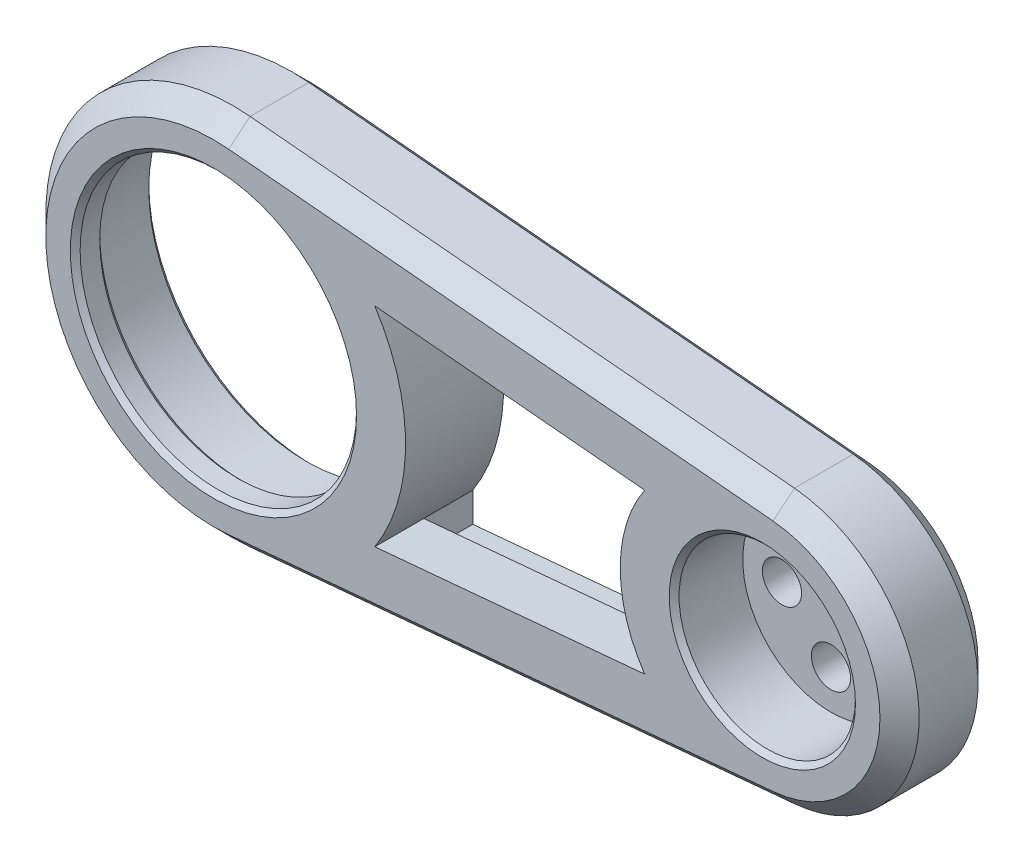
ISO-10303-21;
HEADER;
FILE_DESCRIPTION(('STEP AP214'),'2;1');
FILE_NAME('part.step','',(''),(''),'','','');
FILE_SCHEMA(('AUTOMOTIVE_DESIGN { 1 0 10303 214 1 1 1 1 }'));
ENDSEC;
DATA;
#1=APPLICATION_CONTEXT('core data for automotive mechanical design processes');
#2=APPLICATION_PROTOCOL_DEFINITION('international standard','automotive_design',2000,#1);
#3=PRODUCT_CONTEXT('',#1,'mechanical');
#4=PRODUCT('Part','Part','',(#3));
#5=PRODUCT_RELATED_PRODUCT_CATEGORY('part','',(#4));
#6=PRODUCT_DEFINITION_FORMATION('','',#4);
#7=PRODUCT_DEFINITION_CONTEXT('part definition',#1,'design');
#8=PRODUCT_DEFINITION('design','',#6,#7);
#9=PRODUCT_DEFINITION_SHAPE('','',#8);
#10=(LENGTH_UNIT() NAMED_UNIT(*) SI_UNIT(.MILLI.,.METRE.));
#11=(NAMED_UNIT(*) PLANE_ANGLE_UNIT() SI_UNIT($,.RADIAN.));
#12=(NAMED_UNIT(*) SI_UNIT($,.STERADIAN.) SOLID_ANGLE_UNIT());
#13=UNCERTAINTY_MEASURE_WITH_UNIT(LENGTH_MEASURE(1.E-05),#10,'distance_accuracy_value','');
#14=(GEOMETRIC_REPRESENTATION_CONTEXT(3) GLOBAL_UNCERTAINTY_ASSIGNED_CONTEXT((#13)) GLOBAL_UNIT_ASSIGNED_CONTEXT((#10,
#11,#12)) REPRESENTATION_CONTEXT('',''));
#15=CARTESIAN_POINT('',(0.,0.,0.));
#16=DIRECTION('',(0.,0.,1.));
#17=DIRECTION('',(1.,0.,0.));
#18=AXIS2_PLACEMENT_3D('',#15,#16,#17);
#19=CARTESIAN_POINT('',(1.10196428571428,12.0497167897428,-44.8061825082967));
#20=DIRECTION('',(0.0910714285714284,0.995844362788663,0.));
#21=DIRECTION('',(-0.995844362788664,0.0910714285714284,0.));
#22=AXIS2_PLACEMENT_3D('',#19,#20,#21);
#23=PLANE('',#22);
#24=DIRECTION('',(-0.995844362788664,0.0910714285714284,0.));
#25=VECTOR('',#24,1.);
#26=CARTESIAN_POINT('',(1.10196428571428,12.0497167897428,-5.));
#27=LINE('',#26,#25);
#28=CARTESIAN_POINT('',(43.9918449486673,8.1273742539121,-5.));
#29=VERTEX_POINT('',#28);
#30=CARTESIAN_POINT('',(16.4570318624783,10.6454733233132,-5.));
#31=VERTEX_POINT('',#30);
#32=EDGE_CURVE('E198',#29,#31,#27,.T.);
#33=ORIENTED_EDGE('',*,*,#32,.F.);
#34=DIRECTION('',(0.,0.,1.));
#35=VECTOR('',#34,1.);
#36=CARTESIAN_POINT('',(43.9918449486673,8.1273742539121,-44.8061825082967));
#37=LINE('',#36,#35);
#38=CARTESIAN_POINT('',(43.9918449486673,8.1273742539121,0.));
#39=VERTEX_POINT('',#38);
#40=EDGE_CURVE('E254',#29,#39,#37,.T.);
#41=ORIENTED_EDGE('',*,*,#40,.T.);
#42=DIRECTION('',(-0.995844362788664,0.0910714285714284,0.));
#43=VECTOR('',#42,1.);
#44=CARTESIAN_POINT('',(1.10196428571428,12.0497167897428,0.));
#45=LINE('',#44,#43);
#46=CARTESIAN_POINT('',(16.4570318624783,10.6454733233132,0.));
#47=VERTEX_POINT('',#46);
#48=EDGE_CURVE('E231',#39,#47,#45,.T.);
#49=ORIENTED_EDGE('',*,*,#48,.T.);
#50=DIRECTION('',(0.,0.,1.));
#51=VECTOR('',#50,1.);
#52=CARTESIAN_POINT('',(16.4570318624783,10.6454733233132,-44.8061825082967));
#53=LINE('',#52,#51);
#54=EDGE_CURVE('E235',#31,#47,#53,.T.);
#55=ORIENTED_EDGE('',*,*,#54,.F.);
#56=EDGE_LOOP('',(#33,#41,#49,#55));
#57=FACE_BOUND('',#56,.T.);
#58=ADVANCED_FACE('F50',(#57),#23,.F.);
#59=CARTESIAN_POINT('',(1.10196428571428,-12.0497167897428,-44.8061825082967));
#60=DIRECTION('',(0.0910714285714282,-0.995844362788663,0.));
#61=DIRECTION('',(0.995844362788664,0.0910714285714282,0.));
#62=AXIS2_PLACEMENT_3D('',#59,#60,#61);
#63=PLANE('',#62);
#64=DIRECTION('',(0.995844362788664,0.0910714285714282,0.));
#65=VECTOR('',#64,1.);
#66=CARTESIAN_POINT('',(1.10196428571428,-12.0497167897428,-5.));
#67=LINE('',#66,#65);
#68=CARTESIAN_POINT('',(16.4570318624783,-10.6454733233132,-5.));
#69=VERTEX_POINT('',#68);
#70=CARTESIAN_POINT('',(43.9918449486673,-8.12737425391211,-5.));
#71=VERTEX_POINT('',#70);
#72=EDGE_CURVE('E213',#69,#71,#67,.T.);
#73=ORIENTED_EDGE('',*,*,#72,.F.);
#74=DIRECTION('',(0.,0.,1.));
#75=VECTOR('',#74,1.);
#76=CARTESIAN_POINT('',(16.4570318624783,-10.6454733233132,-44.8061825082967));
#77=LINE('',#76,#75);
#78=CARTESIAN_POINT('',(16.4570318624783,-10.6454733233132,0.));
#79=VERTEX_POINT('',#78);
#80=EDGE_CURVE('E253',#69,#79,#77,.T.);
#81=ORIENTED_EDGE('',*,*,#80,.T.);
#82=DIRECTION('',(0.995844362788664,0.0910714285714282,0.));
#83=VECTOR('',#82,1.);
#84=CARTESIAN_POINT('',(1.10196428571428,-12.0497167897428,0.));
#85=LINE('',#84,#83);
#86=CARTESIAN_POINT('',(43.9918449486673,-8.1273742539121,0.));
#87=VERTEX_POINT('',#86);
#88=EDGE_CURVE('E230',#79,#87,#85,.T.);
#89=ORIENTED_EDGE('',*,*,#88,.T.);
#90=DIRECTION('',(0.,0.,1.));
#91=VECTOR('',#90,1.);
#92=CARTESIAN_POINT('',(43.9918449486673,-8.12737425391211,-44.8061825082967));
#93=LINE('',#92,#91);
#94=EDGE_CURVE('E240',#71,#87,#93,.T.);
#95=ORIENTED_EDGE('',*,*,#94,.F.);
#96=EDGE_LOOP('',(#73,#81,#89,#95));
#97=FACE_BOUND('',#96,.T.);
#98=ADVANCED_FACE('F433',(#97),#63,.F.);
#99=CARTESIAN_POINT('',(0.,0.,-7.));
#100=DIRECTION('',(0.,0.,1.));
#101=DIRECTION('',(1.,0.,0.));
#102=AXIS2_PLACEMENT_3D('',#99,#100,#101);
#103=CYLINDRICAL_SURFACE('',#102,16.1);
#104=CARTESIAN_POINT('',(0.,0.,-9.5));
#105=DIRECTION('',(0.,0.,-1.));
#106=DIRECTION('',(-1.,0.,0.));
#107=AXIS2_PLACEMENT_3D('',#104,#105,#106);
#108=CIRCLE('',#107,16.1);
#109=CARTESIAN_POINT('',(-16.1,0.,-9.5));
#110=VERTEX_POINT('',#109);
#111=EDGE_CURVE('E314',#110,#110,#108,.T.);
#112=ORIENTED_EDGE('',*,*,#111,.T.);
#113=EDGE_LOOP('',(#112));
#114=FACE_BOUND('',#113,.T.);
#115=CARTESIAN_POINT('',(0.,0.,-3.));
#116=DIRECTION('',(0.,0.,1.));
#117=DIRECTION('',(1.,0.,0.));
#118=AXIS2_PLACEMENT_3D('',#115,#116,#117);
#119=CIRCLE('',#118,16.1);
#120=CARTESIAN_POINT('',(16.1,0.,-3.));
#121=VERTEX_POINT('',#120);
#122=EDGE_CURVE('E292',#121,#121,#119,.F.);
#123=ORIENTED_EDGE('',*,*,#122,.F.);
#124=EDGE_LOOP('',(#123));
#125=FACE_BOUND('',#124,.T.);
#126=ADVANCED_FACE('F429',(#114,#125),#103,.F.);
#127=CARTESIAN_POINT('',(1.73946428571429,-19.0206273292635,-7.));
#128=DIRECTION('',(0.0910714285714286,-0.995844362788664,0.));
#129=DIRECTION('',(0.995844362788664,0.0910714285714286,0.));
#130=AXIS2_PLACEMENT_3D('',#127,#128,#129);
#131=PLANE('',#130);
#132=DIRECTION('',(0.,0.,1.));
#133=VECTOR('',#132,1.);
#134=CARTESIAN_POINT('',(1.73946428571429,-19.0206273292635,-7.));
#135=LINE('',#134,#133);
#136=CARTESIAN_POINT('',(1.73946428571429,-19.0206273292635,-7.99999999999998));
#137=VERTEX_POINT('',#136);
#138=CARTESIAN_POINT('',(1.73946428571429,-19.0206273292635,-2.));
#139=VERTEX_POINT('',#138);
#140=EDGE_CURVE('E289',#137,#139,#135,.T.);
#141=ORIENTED_EDGE('',*,*,#140,.F.);
#142=DIRECTION('',(0.995844362788664,0.0910714285714286,0.));
#143=VECTOR('',#142,1.);
#144=CARTESIAN_POINT('',(1.73946428571429,-19.0206273292635,-7.99999999999998));
#145=LINE('',#144,#143);
#146=CARTESIAN_POINT('',(57.275,-13.9418210790413,-7.99999999999998));
#147=VERTEX_POINT('',#146);
#148=EDGE_CURVE('E339',#137,#147,#145,.T.);
#149=ORIENTED_EDGE('',*,*,#148,.T.);
#150=DIRECTION('',(0.,0.,1.));
#151=VECTOR('',#150,1.);
#152=CARTESIAN_POINT('',(57.275,-13.9418210790413,-7.));
#153=LINE('',#152,#151);
#154=CARTESIAN_POINT('',(57.275,-13.9418210790413,-2.));
#155=VERTEX_POINT('',#154);
#156=EDGE_CURVE('E290',#147,#155,#153,.T.);
#157=ORIENTED_EDGE('',*,*,#156,.T.);
#158=DIRECTION('',(-0.995844362788664,-0.0910714285714286,0.));
#159=VECTOR('',#158,1.);
#160=CARTESIAN_POINT('',(1.73946428571429,-19.0206273292635,-2.));
#161=LINE('',#160,#159);
#162=EDGE_CURVE('E337',#155,#139,#161,.T.);
#163=ORIENTED_EDGE('',*,*,#162,.T.);
#164=EDGE_LOOP('',(#141,#149,#157,#163));
#165=FACE_BOUND('',#164,.T.);
#166=ADVANCED_FACE('F404',(#165),#131,.T.);
#167=CARTESIAN_POINT('',(0.,0.,-7.));
#168=DIRECTION('',(0.,0.,1.));
#169=DIRECTION('',(1.,0.,0.));
#170=AXIS2_PLACEMENT_3D('',#167,#168,#169);
#171=CYLINDRICAL_SURFACE('',#170,19.1);
#172=DIRECTION('',(0.,0.,1.));
#173=VECTOR('',#172,1.);
#174=CARTESIAN_POINT('',(1.73946428571429,19.0206273292635,-7.));
#175=LINE('',#174,#173);
#176=CARTESIAN_POINT('',(1.73946428571429,19.0206273292635,-7.99999999999998));
#177=VERTEX_POINT('',#176);
#178=CARTESIAN_POINT('',(1.73946428571429,19.0206273292635,-2.));
#179=VERTEX_POINT('',#178);
#180=EDGE_CURVE('E291',#177,#179,#175,.T.);
#181=ORIENTED_EDGE('',*,*,#180,.F.);
#182=CARTESIAN_POINT('',(0.,0.,-7.99999999999998));
#183=DIRECTION('',(0.,0.,-1.));
#184=DIRECTION('',(-1.,0.,0.));
#185=AXIS2_PLACEMENT_3D('',#182,#183,#184);
#186=CIRCLE('',#185,19.1);
#187=EDGE_CURVE('E341',#177,#137,#186,.F.);
#188=ORIENTED_EDGE('',*,*,#187,.T.);
#189=ORIENTED_EDGE('',*,*,#140,.T.);
#190=CARTESIAN_POINT('',(0.,0.,-2.));
#191=DIRECTION('',(0.,0.,1.));
#192=DIRECTION('',(1.,0.,0.));
#193=AXIS2_PLACEMENT_3D('',#190,#191,#192);
#194=CIRCLE('',#193,19.1);
#195=EDGE_CURVE('E345',#139,#179,#194,.F.);
#196=ORIENTED_EDGE('',*,*,#195,.T.);
#197=EDGE_LOOP('',(#181,#188,#189,#196));
#198=FACE_BOUND('',#197,.T.);
#199=ADVANCED_FACE('F423',(#198),#171,.T.);
#200=CARTESIAN_POINT('',(1.73946428571429,19.0206273292635,-7.));
#201=DIRECTION('',(-0.0910714285714286,-0.995844362788664,0.));
#202=DIRECTION('',(0.995844362788664,-0.0910714285714286,0.));
#203=AXIS2_PLACEMENT_3D('',#200,#201,#202);
#204=PLANE('',#203);
#205=DIRECTION('',(0.,0.,1.));
#206=VECTOR('',#205,1.);
#207=CARTESIAN_POINT('',(57.275,13.9418210790413,-7.));
#208=LINE('',#207,#206);
#209=CARTESIAN_POINT('',(57.275,13.9418210790413,-7.99999999999998));
#210=VERTEX_POINT('',#209);
#211=CARTESIAN_POINT('',(57.275,13.9418210790413,-2.));
#212=VERTEX_POINT('',#211);
#213=EDGE_CURVE('E298',#210,#212,#208,.T.);
#214=ORIENTED_EDGE('',*,*,#213,.F.);
#215=DIRECTION('',(-0.995844362788664,0.0910714285714286,0.));
#216=VECTOR('',#215,1.);
#217=CARTESIAN_POINT('',(1.73946428571429,19.0206273292635,-7.99999999999998));
#218=LINE('',#217,#216);
#219=EDGE_CURVE('E355',#210,#177,#218,.T.);
#220=ORIENTED_EDGE('',*,*,#219,.T.);
#221=ORIENTED_EDGE('',*,*,#180,.T.);
#222=DIRECTION('',(0.995844362788664,-0.0910714285714286,0.));
#223=VECTOR('',#222,1.);
#224=CARTESIAN_POINT('',(57.275,13.9418210790413,-2.));
#225=LINE('',#224,#223);
#226=EDGE_CURVE('E346',#179,#212,#225,.T.);
#227=ORIENTED_EDGE('',*,*,#226,.T.);
#228=EDGE_LOOP('',(#214,#220,#221,#227));
#229=FACE_BOUND('',#228,.T.);
#230=ADVANCED_FACE('F389',(#229),#204,.F.);
#231=CARTESIAN_POINT('',(56.,0.,-7.));
#232=DIRECTION('',(0.,0.,1.));
#233=DIRECTION('',(1.,0.,0.));
#234=AXIS2_PLACEMENT_3D('',#231,#232,#233);
#235=CYLINDRICAL_SURFACE('',#234,14.);
#236=ORIENTED_EDGE('',*,*,#156,.F.);
#237=CARTESIAN_POINT('',(56.,0.,-7.99999999999998));
#238=DIRECTION('',(0.,0.,-1.));
#239=DIRECTION('',(-1.,0.,0.));
#240=AXIS2_PLACEMENT_3D('',#237,#238,#239);
#241=CIRCLE('',#240,14.);
#242=EDGE_CURVE('E347',#147,#210,#241,.F.);
#243=ORIENTED_EDGE('',*,*,#242,.T.);
#244=ORIENTED_EDGE('',*,*,#213,.T.);
#245=CARTESIAN_POINT('',(56.,0.,-2.));
#246=DIRECTION('',(0.,0.,1.));
#247=DIRECTION('',(1.,0.,0.));
#248=AXIS2_PLACEMENT_3D('',#245,#246,#247);
#249=CIRCLE('',#248,14.);
#250=EDGE_CURVE('E348',#212,#155,#249,.F.);
#251=ORIENTED_EDGE('',*,*,#250,.T.);
#252=EDGE_LOOP('',(#236,#243,#244,#251));
#253=FACE_BOUND('',#252,.T.);
#254=ADVANCED_FACE('F392',(#253),#235,.T.);
#255=CARTESIAN_POINT('',(56.,0.,-7.));
#256=DIRECTION('',(0.,0.,1.));
#257=DIRECTION('',(1.,0.,0.));
#258=AXIS2_PLACEMENT_3D('',#255,#256,#257);
#259=CYLINDRICAL_SURFACE('',#258,9.);
#260=CARTESIAN_POINT('',(56.,0.,-0.499999999999981));
#261=DIRECTION('',(0.,0.,1.));
#262=DIRECTION('',(1.,0.,0.));
#263=AXIS2_PLACEMENT_3D('',#260,#261,#262);
#264=CIRCLE('',#263,9.);
#265=CARTESIAN_POINT('',(65.,0.,-0.499999999999981));
#266=VERTEX_POINT('',#265);
#267=EDGE_CURVE('E303',#266,#266,#264,.T.);
#268=ORIENTED_EDGE('',*,*,#267,.T.);
#269=EDGE_LOOP('',(#268));
#270=FACE_BOUND('',#269,.T.);
#271=CARTESIAN_POINT('',(56.,0.,-7.));
#272=DIRECTION('',(0.,0.,1.));
#273=DIRECTION('',(1.,0.,0.));
#274=AXIS2_PLACEMENT_3D('',#271,#272,#273);
#275=CIRCLE('',#274,9.);
#276=CARTESIAN_POINT('',(65.,0.,-7.));
#277=VERTEX_POINT('',#276);
#278=EDGE_CURVE('E285',#277,#277,#275,.T.);
#279=ORIENTED_EDGE('',*,*,#278,.F.);
#280=EDGE_LOOP('',(#279));
#281=FACE_BOUND('',#280,.T.);
#282=ADVANCED_FACE('F476',(#270,#281),#259,.F.);
#283=CARTESIAN_POINT('',(0.,0.,0.));
#284=DIRECTION('',(0.,0.,1.));
#285=DIRECTION('',(1.,0.,0.));
#286=AXIS2_PLACEMENT_3D('',#283,#284,#285);
#287=PLANE('',#286);
#288=ORIENTED_EDGE('',*,*,#48,.F.);
#289=CARTESIAN_POINT('',(56.,0.,0.));
#290=DIRECTION('',(0.,0.,1.));
#291=DIRECTION('',(1.,0.,0.));
#292=AXIS2_PLACEMENT_3D('',#289,#290,#291);
#293=CIRCLE('',#292,14.5);
#294=EDGE_CURVE('E245',#39,#87,#293,.T.);
#295=ORIENTED_EDGE('',*,*,#294,.T.);
#296=ORIENTED_EDGE('',*,*,#88,.F.);
#297=CARTESIAN_POINT('',(0.,0.,0.));
#298=DIRECTION('',(0.,0.,1.));
#299=DIRECTION('',(1.,0.,0.));
#300=AXIS2_PLACEMENT_3D('',#297,#298,#299);
#301=CIRCLE('',#300,19.6);
#302=EDGE_CURVE('E234',#79,#47,#301,.T.);
#303=ORIENTED_EDGE('',*,*,#302,.T.);
#304=EDGE_LOOP('',(#288,#295,#296,#303));
#305=FACE_BOUND('',#304,.T.);
#306=CARTESIAN_POINT('',(0.,0.,0.));
#307=DIRECTION('',(0.,0.,1.));
#308=DIRECTION('',(1.,0.,0.));
#309=AXIS2_PLACEMENT_3D('',#306,#307,#308);
#310=CIRCLE('',#309,17.1);
#311=CARTESIAN_POINT('',(1.55732142857143,17.0289386036861,0.));
#312=VERTEX_POINT('',#311);
#313=CARTESIAN_POINT('',(1.55732142857143,-17.0289386036861,0.));
#314=VERTEX_POINT('',#313);
#315=EDGE_CURVE('E60',#312,#314,#310,.T.);
#316=ORIENTED_EDGE('',*,*,#315,.T.);
#317=DIRECTION('',(0.995844362788664,0.0910714285714286,0.));
#318=VECTOR('',#317,1.);
#319=CARTESIAN_POINT('',(1.55732142857143,-17.0289386036861,0.));
#320=LINE('',#319,#318);
#321=CARTESIAN_POINT('',(57.0928571428571,-11.950132353464,0.));
#322=VERTEX_POINT('',#321);
#323=EDGE_CURVE('E11',#314,#322,#320,.T.);
#324=ORIENTED_EDGE('',*,*,#323,.T.);
#325=CARTESIAN_POINT('',(56.,0.,0.));
#326=DIRECTION('',(0.,0.,1.));
#327=DIRECTION('',(1.,0.,0.));
#328=AXIS2_PLACEMENT_3D('',#325,#326,#327);
#329=CIRCLE('',#328,12.);
#330=CARTESIAN_POINT('',(57.0928571428571,11.9501323534639,0.));
#331=VERTEX_POINT('',#330);
#332=EDGE_CURVE('E358',#322,#331,#329,.T.);
#333=ORIENTED_EDGE('',*,*,#332,.T.);
#334=DIRECTION('',(-0.995844362788664,0.0910714285714286,0.));
#335=VECTOR('',#334,1.);
#336=CARTESIAN_POINT('',(1.55732142857143,17.0289386036861,0.));
#337=LINE('',#336,#335);
#338=EDGE_CURVE('E354',#331,#312,#337,.T.);
#339=ORIENTED_EDGE('',*,*,#338,.T.);
#340=EDGE_LOOP('',(#316,#324,#333,#339));
#341=FACE_BOUND('',#340,.T.);
#342=CARTESIAN_POINT('',(56.,0.,0.));
#343=DIRECTION('',(0.,0.,1.));
#344=DIRECTION('',(1.,0.,0.));
#345=AXIS2_PLACEMENT_3D('',#342,#343,#344);
#346=CIRCLE('',#345,9.5);
#347=CARTESIAN_POINT('',(65.5,0.,0.));
#348=VERTEX_POINT('',#347);
#349=EDGE_CURVE('E307',#348,#348,#346,.F.);
#350=ORIENTED_EDGE('',*,*,#349,.T.);
#351=EDGE_LOOP('',(#350));
#352=FACE_BOUND('',#351,.T.);
#353=CARTESIAN_POINT('',(0.,0.,0.));
#354=DIRECTION('',(0.,0.,1.));
#355=DIRECTION('',(1.,0.,0.));
#356=AXIS2_PLACEMENT_3D('',#353,#354,#355);
#357=CIRCLE('',#356,14.6);
#358=CARTESIAN_POINT('',(14.6,0.,0.));
#359=VERTEX_POINT('',#358);
#360=EDGE_CURVE('E306',#359,#359,#357,.F.);
#361=ORIENTED_EDGE('',*,*,#360,.T.);
#362=EDGE_LOOP('',(#361));
#363=FACE_BOUND('',#362,.T.);
#364=ADVANCED_FACE('F479',(#305,#341,#352,#363),#287,.T.);
#365=CARTESIAN_POINT('',(0.,0.,-7.));
#366=DIRECTION('',(0.,0.,-1.));
#367=DIRECTION('',(-1.,0.,0.));
#368=AXIS2_PLACEMENT_3D('',#365,#366,#367);
#369=PLANE('',#368);
#370=CARTESIAN_POINT('',(56.,5.,-7.));
#371=DIRECTION('',(0.,0.,-1.));
#372=DIRECTION('',(-1.,0.,0.));
#373=AXIS2_PLACEMENT_3D('',#370,#371,#372);
#374=CIRCLE('',#373,2.);
#375=CARTESIAN_POINT('',(54.,5.,-7.));
#376=VERTEX_POINT('',#375);
#377=EDGE_CURVE('E262',#376,#376,#374,.F.);
#378=ORIENTED_EDGE('',*,*,#377,.F.);
#379=EDGE_LOOP('',(#378));
#380=FACE_BOUND('',#379,.T.);
#381=CARTESIAN_POINT('',(60.9999999999999,0.,-7.));
#382=DIRECTION('',(0.,0.,-1.));
#383=DIRECTION('',(-1.,0.,0.));
#384=AXIS2_PLACEMENT_3D('',#381,#382,#383);
#385=CIRCLE('',#384,2.);
#386=CARTESIAN_POINT('',(58.9999999999999,0.,-7.));
#387=VERTEX_POINT('',#386);
#388=EDGE_CURVE('E265',#387,#387,#385,.F.);
#389=ORIENTED_EDGE('',*,*,#388,.F.);
#390=EDGE_LOOP('',(#389));
#391=FACE_BOUND('',#390,.T.);
#392=CARTESIAN_POINT('',(55.9999999999999,-5.,-7.));
#393=DIRECTION('',(0.,0.,-1.));
#394=DIRECTION('',(-1.,0.,0.));
#395=AXIS2_PLACEMENT_3D('',#392,#393,#394);
#396=CIRCLE('',#395,2.00000000000001);
#397=CARTESIAN_POINT('',(53.9999999999999,-5.,-7.));
#398=VERTEX_POINT('',#397);
#399=EDGE_CURVE('E272',#398,#398,#396,.F.);
#400=ORIENTED_EDGE('',*,*,#399,.F.);
#401=EDGE_LOOP('',(#400));
#402=FACE_BOUND('',#401,.T.);
#403=CARTESIAN_POINT('',(50.9999999999999,0.,-7.));
#404=DIRECTION('',(0.,0.,-1.));
#405=DIRECTION('',(-1.,0.,0.));
#406=AXIS2_PLACEMENT_3D('',#403,#404,#405);
#407=CIRCLE('',#406,2.);
#408=CARTESIAN_POINT('',(48.9999999999999,0.,-7.));
#409=VERTEX_POINT('',#408);
#410=EDGE_CURVE('E280',#409,#409,#407,.F.);
#411=ORIENTED_EDGE('',*,*,#410,.F.);
#412=EDGE_LOOP('',(#411));
#413=FACE_BOUND('',#412,.T.);
#414=ORIENTED_EDGE('',*,*,#278,.T.);
#415=EDGE_LOOP('',(#414));
#416=FACE_BOUND('',#415,.T.);
#417=ADVANCED_FACE('F474',(#380,#391,#402,#413,#416),#369,.F.);
#418=CARTESIAN_POINT('',(0.,0.,-10.));
#419=DIRECTION('',(0.,0.,-1.));
#420=DIRECTION('',(-1.,0.,0.));
#421=AXIS2_PLACEMENT_3D('',#418,#419,#420);
#422=PLANE('',#421);
#423=DIRECTION('',(0.,-1.,0.));
#424=VECTOR('',#423,1.);
#425=CARTESIAN_POINT('',(43.9918449486673,0.,-10.));
#426=LINE('',#425,#424);
#427=CARTESIAN_POINT('',(43.9918449486673,11.1398931897015,-10.));
#428=VERTEX_POINT('',#427);
#429=CARTESIAN_POINT('',(43.9918449486673,8.1273742539121,-10.));
#430=VERTEX_POINT('',#429);
#431=EDGE_CURVE('E205',#428,#430,#426,.T.);
#432=ORIENTED_EDGE('',*,*,#431,.F.);
#433=DIRECTION('',(-0.995844362788664,0.0910714285714284,0.));
#434=VECTOR('',#433,1.);
#435=CARTESIAN_POINT('',(1.37517857142857,15.0372498781088,-10.));
#436=LINE('',#435,#434);
#437=CARTESIAN_POINT('',(16.4570318624783,13.6579922591026,-10.));
#438=VERTEX_POINT('',#437);
#439=EDGE_CURVE('E177',#428,#438,#436,.T.);
#440=ORIENTED_EDGE('',*,*,#439,.T.);
#441=DIRECTION('',(0.,-1.,0.));
#442=VECTOR('',#441,1.);
#443=CARTESIAN_POINT('',(16.4570318624783,0.,-10.));
#444=LINE('',#443,#442);
#445=CARTESIAN_POINT('',(16.4570318624783,10.6454733233132,-10.));
#446=VERTEX_POINT('',#445);
#447=EDGE_CURVE('E192',#438,#446,#444,.T.);
#448=ORIENTED_EDGE('',*,*,#447,.T.);
#449=CARTESIAN_POINT('',(0.,0.,-10.));
#450=DIRECTION('',(0.,0.,-1.));
#451=DIRECTION('',(-1.,0.,0.));
#452=AXIS2_PLACEMENT_3D('',#449,#450,#451);
#453=CIRCLE('',#452,19.6);
#454=CARTESIAN_POINT('',(16.4570318624783,-10.6454733233132,-10.));
#455=VERTEX_POINT('',#454);
#456=EDGE_CURVE('E241',#455,#446,#453,.F.);
#457=ORIENTED_EDGE('',*,*,#456,.F.);
#458=DIRECTION('',(0.,1.,0.));
#459=VECTOR('',#458,1.);
#460=CARTESIAN_POINT('',(16.4570318624783,0.,-10.));
#461=LINE('',#460,#459);
#462=CARTESIAN_POINT('',(16.4570318624783,-13.6579922591026,-10.));
#463=VERTEX_POINT('',#462);
#464=EDGE_CURVE('E224',#463,#455,#461,.T.);
#465=ORIENTED_EDGE('',*,*,#464,.F.);
#466=DIRECTION('',(-0.995844362788664,-0.0910714285714282,0.));
#467=VECTOR('',#466,1.);
#468=CARTESIAN_POINT('',(1.37517857142856,-15.0372498781088,-10.));
#469=LINE('',#468,#467);
#470=CARTESIAN_POINT('',(43.9918449486673,-11.1398931897015,-10.));
#471=VERTEX_POINT('',#470);
#472=EDGE_CURVE('E222',#471,#463,#469,.T.);
#473=ORIENTED_EDGE('',*,*,#472,.F.);
#474=DIRECTION('',(0.,1.,0.));
#475=VECTOR('',#474,1.);
#476=CARTESIAN_POINT('',(43.9918449486673,0.,-10.));
#477=LINE('',#476,#475);
#478=CARTESIAN_POINT('',(43.9918449486673,-8.12737425391211,-10.));
#479=VERTEX_POINT('',#478);
#480=EDGE_CURVE('E73',#471,#479,#477,.T.);
#481=ORIENTED_EDGE('',*,*,#480,.T.);
#482=CARTESIAN_POINT('',(56.,0.,-10.));
#483=DIRECTION('',(0.,0.,-1.));
#484=DIRECTION('',(-1.,0.,0.));
#485=AXIS2_PLACEMENT_3D('',#482,#483,#484);
#486=CIRCLE('',#485,14.5);
#487=EDGE_CURVE('E210',#430,#479,#486,.F.);
#488=ORIENTED_EDGE('',*,*,#487,.F.);
#489=EDGE_LOOP('',(#432,#440,#448,#457,#465,#473,#481,#488));
#490=FACE_BOUND('',#489,.T.);
#491=CARTESIAN_POINT('',(56.,5.,-10.));
#492=DIRECTION('',(0.,0.,-1.));
#493=DIRECTION('',(-1.,0.,0.));
#494=AXIS2_PLACEMENT_3D('',#491,#492,#493);
#495=CIRCLE('',#494,2.);
#496=CARTESIAN_POINT('',(54.,5.,-10.));
#497=VERTEX_POINT('',#496);
#498=EDGE_CURVE('E258',#497,#497,#495,.T.);
#499=ORIENTED_EDGE('',*,*,#498,.F.);
#500=EDGE_LOOP('',(#499));
#501=FACE_BOUND('',#500,.T.);
#502=CARTESIAN_POINT('',(60.9999999999999,0.,-10.));
#503=DIRECTION('',(0.,0.,-1.));
#504=DIRECTION('',(-1.,0.,0.));
#505=AXIS2_PLACEMENT_3D('',#502,#503,#504);
#506=CIRCLE('',#505,2.);
#507=CARTESIAN_POINT('',(58.9999999999999,0.,-10.));
#508=VERTEX_POINT('',#507);
#509=EDGE_CURVE('E268',#508,#508,#506,.T.);
#510=ORIENTED_EDGE('',*,*,#509,.F.);
#511=EDGE_LOOP('',(#510));
#512=FACE_BOUND('',#511,.T.);
#513=CARTESIAN_POINT('',(55.9999999999999,-5.,-10.));
#514=DIRECTION('',(0.,0.,-1.));
#515=DIRECTION('',(-1.,0.,0.));
#516=AXIS2_PLACEMENT_3D('',#513,#514,#515);
#517=CIRCLE('',#516,2.00000000000001);
#518=CARTESIAN_POINT('',(53.9999999999999,-5.,-10.));
#519=VERTEX_POINT('',#518);
#520=EDGE_CURVE('E274',#519,#519,#517,.T.);
#521=ORIENTED_EDGE('',*,*,#520,.F.);
#522=EDGE_LOOP('',(#521));
#523=FACE_BOUND('',#522,.T.);
#524=CARTESIAN_POINT('',(50.9999999999999,0.,-10.));
#525=DIRECTION('',(0.,0.,-1.));
#526=DIRECTION('',(-1.,0.,0.));
#527=AXIS2_PLACEMENT_3D('',#524,#525,#526);
#528=CIRCLE('',#527,2.);
#529=CARTESIAN_POINT('',(48.9999999999999,0.,-10.));
#530=VERTEX_POINT('',#529);
#531=EDGE_CURVE('E244',#530,#530,#528,.T.);
#532=ORIENTED_EDGE('',*,*,#531,.F.);
#533=EDGE_LOOP('',(#532));
#534=FACE_BOUND('',#533,.T.);
#535=CARTESIAN_POINT('',(56.,0.,-10.));
#536=DIRECTION('',(0.,0.,-1.));
#537=DIRECTION('',(-1.,0.,0.));
#538=AXIS2_PLACEMENT_3D('',#535,#536,#537);
#539=CIRCLE('',#538,12.);
#540=CARTESIAN_POINT('',(57.0928571428571,11.950132353464,-10.));
#541=VERTEX_POINT('',#540);
#542=CARTESIAN_POINT('',(57.0928571428571,-11.950132353464,-10.));
#543=VERTEX_POINT('',#542);
#544=EDGE_CURVE('E330',#541,#543,#539,.T.);
#545=ORIENTED_EDGE('',*,*,#544,.T.);
#546=DIRECTION('',(-0.995844362788664,-0.0910714285714286,0.));
#547=VECTOR('',#546,1.);
#548=CARTESIAN_POINT('',(1.55732142857143,-17.0289386036861,-10.));
#549=LINE('',#548,#547);
#550=CARTESIAN_POINT('',(1.55732142857143,-17.0289386036861,-10.));
#551=VERTEX_POINT('',#550);
#552=EDGE_CURVE('E333',#543,#551,#549,.T.);
#553=ORIENTED_EDGE('',*,*,#552,.T.);
#554=CARTESIAN_POINT('',(0.,0.,-10.));
#555=DIRECTION('',(0.,0.,-1.));
#556=DIRECTION('',(-1.,0.,0.));
#557=AXIS2_PLACEMENT_3D('',#554,#555,#556);
#558=CIRCLE('',#557,17.1);
#559=CARTESIAN_POINT('',(1.55732142857143,17.0289386036861,-10.));
#560=VERTEX_POINT('',#559);
#561=EDGE_CURVE('E332',#551,#560,#558,.T.);
#562=ORIENTED_EDGE('',*,*,#561,.T.);
#563=DIRECTION('',(0.995844362788664,-0.0910714285714286,0.));
#564=VECTOR('',#563,1.);
#565=CARTESIAN_POINT('',(57.0928571428571,11.950132353464,-10.));
#566=LINE('',#565,#564);
#567=EDGE_CURVE('E329',#560,#541,#566,.T.);
#568=ORIENTED_EDGE('',*,*,#567,.T.);
#569=EDGE_LOOP('',(#545,#553,#562,#568));
#570=FACE_BOUND('',#569,.T.);
#571=CARTESIAN_POINT('',(0.,0.,-10.));
#572=DIRECTION('',(0.,0.,-1.));
#573=DIRECTION('',(-1.,0.,0.));
#574=AXIS2_PLACEMENT_3D('',#571,#572,#573);
#575=CIRCLE('',#574,16.6);
#576=CARTESIAN_POINT('',(-16.6,0.,-10.));
#577=VERTEX_POINT('',#576);
#578=EDGE_CURVE('E315',#577,#577,#575,.F.);
#579=ORIENTED_EDGE('',*,*,#578,.T.);
#580=EDGE_LOOP('',(#579));
#581=FACE_BOUND('',#580,.T.);
#582=ADVANCED_FACE('F417',(#490,#501,#512,#523,#534,#570,#581),#422,.T.);
#583=CARTESIAN_POINT('',(0.,0.,-3.));
#584=DIRECTION('',(0.,0.,1.));
#585=DIRECTION('',(1.,0.,0.));
#586=AXIS2_PLACEMENT_3D('',#583,#584,#585);
#587=PLANE('',#586);
#588=CARTESIAN_POINT('',(0.,0.,-3.));
#589=DIRECTION('',(0.,0.,1.));
#590=DIRECTION('',(1.,0.,0.));
#591=AXIS2_PLACEMENT_3D('',#588,#589,#590);
#592=CIRCLE('',#591,14.6);
#593=CARTESIAN_POINT('',(14.6,0.,-3.));
#594=VERTEX_POINT('',#593);
#595=EDGE_CURVE('E319',#594,#594,#592,.T.);
#596=ORIENTED_EDGE('',*,*,#595,.T.);
#597=EDGE_LOOP('',(#596));
#598=FACE_BOUND('',#597,.T.);
#599=ORIENTED_EDGE('',*,*,#122,.T.);
#600=EDGE_LOOP('',(#599));
#601=FACE_BOUND('',#600,.T.);
#602=ADVANCED_FACE('F467',(#598,#601),#587,.F.);
#603=CARTESIAN_POINT('',(0.,0.,-3.));
#604=DIRECTION('',(0.,0.,1.));
#605=DIRECTION('',(1.,0.,0.));
#606=AXIS2_PLACEMENT_3D('',#603,#604,#605);
#607=CYLINDRICAL_SURFACE('',#606,14.1);
#608=CARTESIAN_POINT('',(0.,0.,-2.50000000000001));
#609=DIRECTION('',(0.,0.,1.));
#610=DIRECTION('',(1.,0.,0.));
#611=AXIS2_PLACEMENT_3D('',#608,#609,#610);
#612=CIRCLE('',#611,14.1);
#613=CARTESIAN_POINT('',(14.1,0.,-2.50000000000001));
#614=VERTEX_POINT('',#613);
#615=EDGE_CURVE('E321',#614,#614,#612,.F.);
#616=ORIENTED_EDGE('',*,*,#615,.T.);
#617=EDGE_LOOP('',(#616));
#618=FACE_BOUND('',#617,.T.);
#619=CARTESIAN_POINT('',(0.,0.,-0.499999999999995));
#620=DIRECTION('',(0.,0.,1.));
#621=DIRECTION('',(1.,0.,0.));
#622=AXIS2_PLACEMENT_3D('',#619,#620,#621);
#623=CIRCLE('',#622,14.1);
#624=CARTESIAN_POINT('',(14.1,0.,-0.499999999999995));
#625=VERTEX_POINT('',#624);
#626=EDGE_CURVE('E322',#625,#625,#623,.T.);
#627=ORIENTED_EDGE('',*,*,#626,.T.);
#628=EDGE_LOOP('',(#627));
#629=FACE_BOUND('',#628,.T.);
#630=ADVANCED_FACE('F465',(#618,#629),#607,.F.);
#631=CARTESIAN_POINT('',(56.,0.,-0.499999999999981));
#632=DIRECTION('',(0.,0.,1.));
#633=DIRECTION('',(1.,0.,0.));
#634=AXIS2_PLACEMENT_3D('',#631,#632,#633);
#635=CONICAL_SURFACE('',#634,9.,0.785398163397459);
#636=ORIENTED_EDGE('',*,*,#349,.F.);
#637=EDGE_LOOP('',(#636));
#638=FACE_BOUND('',#637,.T.);
#639=ORIENTED_EDGE('',*,*,#267,.F.);
#640=EDGE_LOOP('',(#639));
#641=FACE_BOUND('',#640,.T.);
#642=ADVANCED_FACE('F461',(#638,#641),#635,.F.);
#643=CARTESIAN_POINT('',(0.,0.,-10.));
#644=DIRECTION('',(0.,0.,-1.));
#645=DIRECTION('',(-1.,0.,0.));
#646=AXIS2_PLACEMENT_3D('',#643,#644,#645);
#647=CONICAL_SURFACE('',#646,16.6,0.785398163397441);
#648=ORIENTED_EDGE('',*,*,#111,.F.);
#649=EDGE_LOOP('',(#648));
#650=FACE_BOUND('',#649,.T.);
#651=ORIENTED_EDGE('',*,*,#578,.F.);
#652=EDGE_LOOP('',(#651));
#653=FACE_BOUND('',#652,.T.);
#654=ADVANCED_FACE('F491',(#650,#653),#647,.F.);
#655=CARTESIAN_POINT('',(0.,0.,-3.));
#656=DIRECTION('',(0.,0.,-1.));
#657=DIRECTION('',(-1.,0.,0.));
#658=AXIS2_PLACEMENT_3D('',#655,#656,#657);
#659=CONICAL_SURFACE('',#658,14.6,0.785398163397448);
#660=ORIENTED_EDGE('',*,*,#615,.F.);
#661=EDGE_LOOP('',(#660));
#662=FACE_BOUND('',#661,.T.);
#663=ORIENTED_EDGE('',*,*,#595,.F.);
#664=EDGE_LOOP('',(#663));
#665=FACE_BOUND('',#664,.T.);
#666=ADVANCED_FACE('F496',(#662,#665),#659,.F.);
#667=CARTESIAN_POINT('',(0.,0.,-0.499999999999995));
#668=DIRECTION('',(0.,0.,1.));
#669=DIRECTION('',(1.,0.,0.));
#670=AXIS2_PLACEMENT_3D('',#667,#668,#669);
#671=CONICAL_SURFACE('',#670,14.1,0.785398163397455);
#672=ORIENTED_EDGE('',*,*,#360,.F.);
#673=EDGE_LOOP('',(#672));
#674=FACE_BOUND('',#673,.T.);
#675=ORIENTED_EDGE('',*,*,#626,.F.);
#676=EDGE_LOOP('',(#675));
#677=FACE_BOUND('',#676,.T.);
#678=ADVANCED_FACE('F503',(#674,#677),#671,.F.);
#679=CARTESIAN_POINT('',(1.55732142857143,17.0289386036861,-10.));
#680=DIRECTION('',(0.0643972247152036,0.704168301934263,-0.707106781186545));
#681=DIRECTION('',(-0.995844362788664,0.0910714285714286,0.));
#682=AXIS2_PLACEMENT_3D('',#679,#680,#681);
#683=PLANE('',#682);
#684=DIRECTION('',(-0.0643972247152032,-0.704168301934258,-0.70710678118655));
#685=VECTOR('',#684,1.);
#686=CARTESIAN_POINT('',(1.73946428571429,19.0206273292635,-7.99999999999998));
#687=LINE('',#686,#685);
#688=EDGE_CURVE('E361',#177,#560,#687,.T.);
#689=ORIENTED_EDGE('',*,*,#688,.F.);
#690=ORIENTED_EDGE('',*,*,#219,.F.);
#691=DIRECTION('',(0.0643972247152041,0.704168301934258,0.70710678118655));
#692=VECTOR('',#691,1.);
#693=CARTESIAN_POINT('',(57.0928571428571,11.950132353464,-10.));
#694=LINE('',#693,#692);
#695=EDGE_CURVE('E288',#541,#210,#694,.T.);
#696=ORIENTED_EDGE('',*,*,#695,.F.);
#697=ORIENTED_EDGE('',*,*,#567,.F.);
#698=EDGE_LOOP('',(#689,#690,#696,#697));
#699=FACE_BOUND('',#698,.T.);
#700=ADVANCED_FACE('F419',(#699),#683,.T.);
#701=CARTESIAN_POINT('',(56.,0.,-10.));
#702=DIRECTION('',(0.,0.,1.));
#703=DIRECTION('',(1.,0.,0.));
#704=AXIS2_PLACEMENT_3D('',#701,#702,#703);
#705=CONICAL_SURFACE('',#704,12.,0.785398163397444);
#706=ORIENTED_EDGE('',*,*,#695,.T.);
#707=ORIENTED_EDGE('',*,*,#242,.F.);
#708=DIRECTION('',(0.0643972247152042,-0.704168301934257,0.707106781186551));
#709=VECTOR('',#708,1.);
#710=CARTESIAN_POINT('',(57.0928571428571,-11.950132353464,-10.));
#711=LINE('',#710,#709);
#712=EDGE_CURVE('E363',#543,#147,#711,.T.);
#713=ORIENTED_EDGE('',*,*,#712,.F.);
#714=ORIENTED_EDGE('',*,*,#544,.F.);
#715=EDGE_LOOP('',(#706,#707,#713,#714));
#716=FACE_BOUND('',#715,.T.);
#717=ADVANCED_FACE('F400',(#716),#705,.T.);
#718=CARTESIAN_POINT('',(0.,0.,-10.));
#719=DIRECTION('',(0.,0.,1.));
#720=DIRECTION('',(1.,0.,0.));
#721=AXIS2_PLACEMENT_3D('',#718,#719,#720);
#722=CONICAL_SURFACE('',#721,17.1,0.785398163397444);
#723=ORIENTED_EDGE('',*,*,#688,.T.);
#724=ORIENTED_EDGE('',*,*,#561,.F.);
#725=DIRECTION('',(-0.0643972247152032,0.704168301934258,-0.70710678118655));
#726=VECTOR('',#725,1.);
#727=CARTESIAN_POINT('',(1.73946428571429,-19.0206273292635,-7.99999999999998));
#728=LINE('',#727,#726);
#729=EDGE_CURVE('E360',#137,#551,#728,.T.);
#730=ORIENTED_EDGE('',*,*,#729,.F.);
#731=ORIENTED_EDGE('',*,*,#187,.F.);
#732=EDGE_LOOP('',(#723,#724,#730,#731));
#733=FACE_BOUND('',#732,.T.);
#734=ADVANCED_FACE('F414',(#733),#722,.T.);
#735=CARTESIAN_POINT('',(1.55732142857143,-17.0289386036861,-10.));
#736=DIRECTION('',(-0.0643972247152036,0.704168301934263,0.707106781186545));
#737=DIRECTION('',(-0.995844362788664,-0.0910714285714286,0.));
#738=AXIS2_PLACEMENT_3D('',#735,#736,#737);
#739=PLANE('',#738);
#740=ORIENTED_EDGE('',*,*,#712,.T.);
#741=ORIENTED_EDGE('',*,*,#148,.F.);
#742=ORIENTED_EDGE('',*,*,#729,.T.);
#743=ORIENTED_EDGE('',*,*,#552,.F.);
#744=EDGE_LOOP('',(#740,#741,#742,#743));
#745=FACE_BOUND('',#744,.T.);
#746=ADVANCED_FACE('F409',(#745),#739,.F.);
#747=CARTESIAN_POINT('',(1.73946428571429,19.0206273292635,-2.));
#748=DIRECTION('',(0.0643972247152032,0.704168301934258,0.70710678118655));
#749=DIRECTION('',(-0.995844362788664,0.0910714285714286,0.));
#750=AXIS2_PLACEMENT_3D('',#747,#748,#749);
#751=PLANE('',#750);
#752=DIRECTION('',(-0.0643972247152041,-0.704168301934263,0.707106781186545));
#753=VECTOR('',#752,1.);
#754=CARTESIAN_POINT('',(57.275,13.9418210790413,-2.));
#755=LINE('',#754,#753);
#756=EDGE_CURVE('E369',#212,#331,#755,.T.);
#757=ORIENTED_EDGE('',*,*,#756,.F.);
#758=ORIENTED_EDGE('',*,*,#226,.F.);
#759=DIRECTION('',(0.0643972247152036,0.704168301934263,-0.707106781186545));
#760=VECTOR('',#759,1.);
#761=CARTESIAN_POINT('',(1.55732142857143,17.0289386036861,0.));
#762=LINE('',#761,#760);
#763=EDGE_CURVE('E55',#312,#179,#762,.T.);
#764=ORIENTED_EDGE('',*,*,#763,.F.);
#765=ORIENTED_EDGE('',*,*,#338,.F.);
#766=EDGE_LOOP('',(#757,#758,#764,#765));
#767=FACE_BOUND('',#766,.T.);
#768=ADVANCED_FACE('F49',(#767),#751,.T.);
#769=CARTESIAN_POINT('',(0.,0.,0.));
#770=DIRECTION('',(0.,0.,-1.));
#771=DIRECTION('',(-1.,0.,0.));
#772=AXIS2_PLACEMENT_3D('',#769,#770,#771);
#773=CONICAL_SURFACE('',#772,17.1,0.785398163397451);
#774=ORIENTED_EDGE('',*,*,#763,.T.);
#775=ORIENTED_EDGE('',*,*,#195,.F.);
#776=DIRECTION('',(0.0643972247152036,-0.704168301934262,-0.707106781186546));
#777=VECTOR('',#776,1.);
#778=CARTESIAN_POINT('',(1.55732142857143,-17.0289386036861,0.));
#779=LINE('',#778,#777);
#780=EDGE_CURVE('E367',#314,#139,#779,.T.);
#781=ORIENTED_EDGE('',*,*,#780,.F.);
#782=ORIENTED_EDGE('',*,*,#315,.F.);
#783=EDGE_LOOP('',(#774,#775,#781,#782));
#784=FACE_BOUND('',#783,.T.);
#785=ADVANCED_FACE('F382',(#784),#773,.T.);
#786=CARTESIAN_POINT('',(56.,0.,0.));
#787=DIRECTION('',(0.,0.,-1.));
#788=DIRECTION('',(-1.,0.,0.));
#789=AXIS2_PLACEMENT_3D('',#786,#787,#788);
#790=CONICAL_SURFACE('',#789,12.,0.785398163397451);
#791=ORIENTED_EDGE('',*,*,#756,.T.);
#792=ORIENTED_EDGE('',*,*,#332,.F.);
#793=DIRECTION('',(-0.0643972247152042,0.704168301934262,0.707106781186546));
#794=VECTOR('',#793,1.);
#795=CARTESIAN_POINT('',(57.275,-13.9418210790413,-2.));
#796=LINE('',#795,#794);
#797=EDGE_CURVE('E270',#155,#322,#796,.T.);
#798=ORIENTED_EDGE('',*,*,#797,.F.);
#799=ORIENTED_EDGE('',*,*,#250,.F.);
#800=EDGE_LOOP('',(#791,#792,#798,#799));
#801=FACE_BOUND('',#800,.T.);
#802=ADVANCED_FACE('F548',(#801),#790,.T.);
#803=CARTESIAN_POINT('',(1.55732142857143,-17.0289386036861,0.));
#804=DIRECTION('',(-0.0643972247152032,0.704168301934258,-0.70710678118655));
#805=DIRECTION('',(0.995844362788664,0.0910714285714286,0.));
#806=AXIS2_PLACEMENT_3D('',#803,#804,#805);
#807=PLANE('',#806);
#808=ORIENTED_EDGE('',*,*,#780,.T.);
#809=ORIENTED_EDGE('',*,*,#162,.F.);
#810=ORIENTED_EDGE('',*,*,#797,.T.);
#811=ORIENTED_EDGE('',*,*,#323,.F.);
#812=EDGE_LOOP('',(#808,#809,#810,#811));
#813=FACE_BOUND('',#812,.T.);
#814=ADVANCED_FACE('F456',(#813),#807,.F.);
#815=CARTESIAN_POINT('',(50.9999999999999,0.,-1.3431457505076));
#816=DIRECTION('',(0.,0.,-1.));
#817=DIRECTION('',(-1.,0.,0.));
#818=AXIS2_PLACEMENT_3D('',#815,#816,#817);
#819=CYLINDRICAL_SURFACE('',#818,2.);
#820=ORIENTED_EDGE('',*,*,#410,.T.);
#821=EDGE_LOOP('',(#820));
#822=FACE_BOUND('',#821,.T.);
#823=ORIENTED_EDGE('',*,*,#531,.T.);
#824=EDGE_LOOP('',(#823));
#825=FACE_BOUND('',#824,.T.);
#826=ADVANCED_FACE('F458',(#822,#825),#819,.F.);
#827=CARTESIAN_POINT('',(55.9999999999999,-5.,-1.3431457505076));
#828=DIRECTION('',(0.,0.,-1.));
#829=DIRECTION('',(-1.,0.,0.));
#830=AXIS2_PLACEMENT_3D('',#827,#828,#829);
#831=CYLINDRICAL_SURFACE('',#830,2.00000000000001);
#832=ORIENTED_EDGE('',*,*,#399,.T.);
#833=EDGE_LOOP('',(#832));
#834=FACE_BOUND('',#833,.T.);
#835=ORIENTED_EDGE('',*,*,#520,.T.);
#836=EDGE_LOOP('',(#835));
#837=FACE_BOUND('',#836,.T.);
#838=ADVANCED_FACE('F455',(#834,#837),#831,.F.);
#839=CARTESIAN_POINT('',(60.9999999999999,0.,-1.3431457505076));
#840=DIRECTION('',(0.,0.,-1.));
#841=DIRECTION('',(-1.,0.,0.));
#842=AXIS2_PLACEMENT_3D('',#839,#840,#841);
#843=CYLINDRICAL_SURFACE('',#842,2.);
#844=ORIENTED_EDGE('',*,*,#388,.T.);
#845=EDGE_LOOP('',(#844));
#846=FACE_BOUND('',#845,.T.);
#847=ORIENTED_EDGE('',*,*,#509,.T.);
#848=EDGE_LOOP('',(#847));
#849=FACE_BOUND('',#848,.T.);
#850=ADVANCED_FACE('F449',(#846,#849),#843,.F.);
#851=CARTESIAN_POINT('',(56.,5.,-1.3431457505076));
#852=DIRECTION('',(0.,0.,-1.));
#853=DIRECTION('',(-1.,0.,0.));
#854=AXIS2_PLACEMENT_3D('',#851,#852,#853);
#855=CYLINDRICAL_SURFACE('',#854,2.);
#856=ORIENTED_EDGE('',*,*,#377,.T.);
#857=EDGE_LOOP('',(#856));
#858=FACE_BOUND('',#857,.T.);
#859=ORIENTED_EDGE('',*,*,#498,.T.);
#860=EDGE_LOOP('',(#859));
#861=FACE_BOUND('',#860,.T.);
#862=ADVANCED_FACE('F444',(#858,#861),#855,.F.);
#863=CARTESIAN_POINT('',(0.,0.,-44.8061825082967));
#864=DIRECTION('',(0.,0.,1.));
#865=DIRECTION('',(1.,0.,0.));
#866=AXIS2_PLACEMENT_3D('',#863,#864,#865);
#867=CYLINDRICAL_SURFACE('',#866,19.6);
#868=ORIENTED_EDGE('',*,*,#456,.T.);
#869=EDGE_CURVE('E257',#446,#31,#53,.T.);
#870=ORIENTED_EDGE('',*,*,#869,.T.);
#871=ORIENTED_EDGE('',*,*,#54,.T.);
#872=ORIENTED_EDGE('',*,*,#302,.F.);
#873=ORIENTED_EDGE('',*,*,#80,.F.);
#874=EDGE_CURVE('E238',#455,#69,#77,.T.);
#875=ORIENTED_EDGE('',*,*,#874,.F.);
#876=EDGE_LOOP('',(#868,#870,#871,#872,#873,#875));
#877=FACE_BOUND('',#876,.T.);
#878=ADVANCED_FACE('F443',(#877),#867,.T.);
#879=CARTESIAN_POINT('',(56.,0.,-44.8061825082967));
#880=DIRECTION('',(0.,0.,1.));
#881=DIRECTION('',(1.,0.,0.));
#882=AXIS2_PLACEMENT_3D('',#879,#880,#881);
#883=CYLINDRICAL_SURFACE('',#882,14.5);
#884=ORIENTED_EDGE('',*,*,#487,.T.);
#885=EDGE_CURVE('E249',#479,#71,#93,.T.);
#886=ORIENTED_EDGE('',*,*,#885,.T.);
#887=ORIENTED_EDGE('',*,*,#94,.T.);
#888=ORIENTED_EDGE('',*,*,#294,.F.);
#889=ORIENTED_EDGE('',*,*,#40,.F.);
#890=EDGE_CURVE('E193',#430,#29,#37,.T.);
#891=ORIENTED_EDGE('',*,*,#890,.F.);
#892=EDGE_LOOP('',(#884,#886,#887,#888,#889,#891));
#893=FACE_BOUND('',#892,.T.);
#894=ADVANCED_FACE('F738',(#893),#883,.T.);
#895=CARTESIAN_POINT('',(1.37517857142856,-15.0372498781088,-5.));
#896=DIRECTION('',(0.0910714285714282,-0.995844362788664,0.));
#897=DIRECTION('',(0.995844362788664,0.0910714285714282,0.));
#898=AXIS2_PLACEMENT_3D('',#895,#896,#897);
#899=PLANE('',#898);
#900=ORIENTED_EDGE('',*,*,#472,.T.);
#901=DIRECTION('',(0.,0.,-1.));
#902=VECTOR('',#901,1.);
#903=CARTESIAN_POINT('',(16.4570318624783,-13.6579922591026,-5.));
#904=LINE('',#903,#902);
#905=CARTESIAN_POINT('',(16.4570318624783,-13.6579922591026,-5.));
#906=VERTEX_POINT('',#905);
#907=EDGE_CURVE('E216',#906,#463,#904,.T.);
#908=ORIENTED_EDGE('',*,*,#907,.F.);
#909=DIRECTION('',(-0.995844362788664,-0.0910714285714282,0.));
#910=VECTOR('',#909,1.);
#911=CARTESIAN_POINT('',(1.37517857142856,-15.0372498781088,-5.));
#912=LINE('',#911,#910);
#913=CARTESIAN_POINT('',(43.9918449486673,-11.1398931897015,-5.));
#914=VERTEX_POINT('',#913);
#915=EDGE_CURVE('E209',#914,#906,#912,.T.);
#916=ORIENTED_EDGE('',*,*,#915,.F.);
#917=DIRECTION('',(0.,0.,-1.));
#918=VECTOR('',#917,1.);
#919=CARTESIAN_POINT('',(43.9918449486673,-11.1398931897015,-5.));
#920=LINE('',#919,#918);
#921=EDGE_CURVE('E203',#914,#471,#920,.T.);
#922=ORIENTED_EDGE('',*,*,#921,.T.);
#923=EDGE_LOOP('',(#900,#908,#916,#922));
#924=FACE_BOUND('',#923,.T.);
#925=ADVANCED_FACE('F741',(#924),#899,.F.);
#926=CARTESIAN_POINT('',(43.9918449486673,0.,-5.));
#927=DIRECTION('',(-1.,0.,0.));
#928=DIRECTION('',(0.,0.,1.));
#929=AXIS2_PLACEMENT_3D('',#926,#927,#928);
#930=PLANE('',#929);
#931=ORIENTED_EDGE('',*,*,#480,.F.);
#932=ORIENTED_EDGE('',*,*,#921,.F.);
#933=DIRECTION('',(0.,1.,0.));
#934=VECTOR('',#933,1.);
#935=CARTESIAN_POINT('',(43.9918449486673,0.,-5.));
#936=LINE('',#935,#934);
#937=EDGE_CURVE('E217',#914,#71,#936,.T.);
#938=ORIENTED_EDGE('',*,*,#937,.T.);
#939=ORIENTED_EDGE('',*,*,#885,.F.);
#940=EDGE_LOOP('',(#931,#932,#938,#939));
#941=FACE_BOUND('',#940,.T.);
#942=ADVANCED_FACE('F762',(#941),#930,.T.);
#943=CARTESIAN_POINT('',(16.4570318624783,0.,-5.));
#944=DIRECTION('',(-1.,0.,0.));
#945=DIRECTION('',(0.,0.,1.));
#946=AXIS2_PLACEMENT_3D('',#943,#944,#945);
#947=PLANE('',#946);
#948=ORIENTED_EDGE('',*,*,#464,.T.);
#949=ORIENTED_EDGE('',*,*,#874,.T.);
#950=DIRECTION('',(0.,1.,0.));
#951=VECTOR('',#950,1.);
#952=CARTESIAN_POINT('',(16.4570318624783,0.,-5.));
#953=LINE('',#952,#951);
#954=EDGE_CURVE('E215',#906,#69,#953,.T.);
#955=ORIENTED_EDGE('',*,*,#954,.F.);
#956=ORIENTED_EDGE('',*,*,#907,.T.);
#957=EDGE_LOOP('',(#948,#949,#955,#956));
#958=FACE_BOUND('',#957,.T.);
#959=ADVANCED_FACE('F771',(#958),#947,.F.);
#960=CARTESIAN_POINT('',(0.,0.,-5.));
#961=DIRECTION('',(0.,0.,-1.));
#962=DIRECTION('',(-1.,0.,0.));
#963=AXIS2_PLACEMENT_3D('',#960,#961,#962);
#964=PLANE('',#963);
#965=ORIENTED_EDGE('',*,*,#915,.T.);
#966=ORIENTED_EDGE('',*,*,#954,.T.);
#967=ORIENTED_EDGE('',*,*,#72,.T.);
#968=ORIENTED_EDGE('',*,*,#937,.F.);
#969=EDGE_LOOP('',(#965,#966,#967,#968));
#970=FACE_BOUND('',#969,.T.);
#971=ADVANCED_FACE('F782',(#970),#964,.T.);
#972=CARTESIAN_POINT('',(1.37517857142857,15.0372498781088,-5.));
#973=DIRECTION('',(-0.0910714285714284,-0.995844362788664,0.));
#974=DIRECTION('',(0.995844362788664,-0.0910714285714284,0.));
#975=AXIS2_PLACEMENT_3D('',#972,#973,#974);
#976=PLANE('',#975);
#977=ORIENTED_EDGE('',*,*,#439,.F.);
#978=DIRECTION('',(0.,0.,-1.));
#979=VECTOR('',#978,1.);
#980=CARTESIAN_POINT('',(43.9918449486673,11.1398931897015,-5.));
#981=LINE('',#980,#979);
#982=CARTESIAN_POINT('',(43.9918449486673,11.1398931897015,-5.));
#983=VERTEX_POINT('',#982);
#984=EDGE_CURVE('E172',#983,#428,#981,.T.);
#985=ORIENTED_EDGE('',*,*,#984,.F.);
#986=DIRECTION('',(-0.995844362788664,0.0910714285714284,0.));
#987=VECTOR('',#986,1.);
#988=CARTESIAN_POINT('',(1.37517857142857,15.0372498781088,-5.));
#989=LINE('',#988,#987);
#990=CARTESIAN_POINT('',(16.4570318624783,13.6579922591026,-5.));
#991=VERTEX_POINT('',#990);
#992=EDGE_CURVE('E180',#983,#991,#989,.T.);
#993=ORIENTED_EDGE('',*,*,#992,.T.);
#994=DIRECTION('',(0.,0.,-1.));
#995=VECTOR('',#994,1.);
#996=CARTESIAN_POINT('',(16.4570318624783,13.6579922591026,-5.));
#997=LINE('',#996,#995);
#998=EDGE_CURVE('E63',#991,#438,#997,.T.);
#999=ORIENTED_EDGE('',*,*,#998,.T.);
#1000=EDGE_LOOP('',(#977,#985,#993,#999));
#1001=FACE_BOUND('',#1000,.T.);
#1002=ADVANCED_FACE('F176',(#1001),#976,.T.);
#1003=CARTESIAN_POINT('',(16.4570318624783,0.,-5.));
#1004=DIRECTION('',(1.,0.,0.));
#1005=DIRECTION('',(0.,0.,-1.));
#1006=AXIS2_PLACEMENT_3D('',#1003,#1004,#1005);
#1007=PLANE('',#1006);
#1008=ORIENTED_EDGE('',*,*,#447,.F.);
#1009=ORIENTED_EDGE('',*,*,#998,.F.);
#1010=DIRECTION('',(0.,-1.,0.));
#1011=VECTOR('',#1010,1.);
#1012=CARTESIAN_POINT('',(16.4570318624783,0.,-5.));
#1013=LINE('',#1012,#1011);
#1014=EDGE_CURVE('E182',#991,#31,#1013,.T.);
#1015=ORIENTED_EDGE('',*,*,#1014,.T.);
#1016=ORIENTED_EDGE('',*,*,#869,.F.);
#1017=EDGE_LOOP('',(#1008,#1009,#1015,#1016));
#1018=FACE_BOUND('',#1017,.T.);
#1019=ADVANCED_FACE('F804',(#1018),#1007,.T.);
#1020=CARTESIAN_POINT('',(43.9918449486673,0.,-5.));
#1021=DIRECTION('',(1.,0.,0.));
#1022=DIRECTION('',(0.,0.,-1.));
#1023=AXIS2_PLACEMENT_3D('',#1020,#1021,#1022);
#1024=PLANE('',#1023);
#1025=ORIENTED_EDGE('',*,*,#431,.T.);
#1026=ORIENTED_EDGE('',*,*,#890,.T.);
#1027=DIRECTION('',(0.,-1.,0.));
#1028=VECTOR('',#1027,1.);
#1029=CARTESIAN_POINT('',(43.9918449486673,0.,-5.));
#1030=LINE('',#1029,#1028);
#1031=EDGE_CURVE('E186',#983,#29,#1030,.T.);
#1032=ORIENTED_EDGE('',*,*,#1031,.F.);
#1033=ORIENTED_EDGE('',*,*,#984,.T.);
#1034=EDGE_LOOP('',(#1025,#1026,#1032,#1033));
#1035=FACE_BOUND('',#1034,.T.);
#1036=ADVANCED_FACE('F194',(#1035),#1024,.F.);
#1037=CARTESIAN_POINT('',(0.,0.,-5.));
#1038=DIRECTION('',(0.,0.,-1.));
#1039=DIRECTION('',(-1.,0.,0.));
#1040=AXIS2_PLACEMENT_3D('',#1037,#1038,#1039);
#1041=PLANE('',#1040);
#1042=ORIENTED_EDGE('',*,*,#992,.F.);
#1043=ORIENTED_EDGE('',*,*,#1031,.T.);
#1044=ORIENTED_EDGE('',*,*,#32,.T.);
#1045=ORIENTED_EDGE('',*,*,#1014,.F.);
#1046=EDGE_LOOP('',(#1042,#1043,#1044,#1045));
#1047=FACE_BOUND('',#1046,.T.);
#1048=ADVANCED_FACE('F190',(#1047),#1041,.T.);
#1049=CLOSED_SHELL('',(#58,#98,#126,#166,#199,#230,#254,#282,#364,#417,#582,#602,#630,#642,#654,
#666,#678,#700,#717,#734,#746,#768,#785,#802,#814,#826,#838,#850,#862,#878,#894,#925,#942,#959,
#971,#1002,#1019,#1036,#1048));
#1050=MANIFOLD_SOLID_BREP('B2',#1049);
#1051=ADVANCED_BREP_SHAPE_REPRESENTATION('',(#18,#1050),#14);
#1052=SHAPE_DEFINITION_REPRESENTATION(#9,#1051);
ENDSEC;
END-ISO-10303-21;
